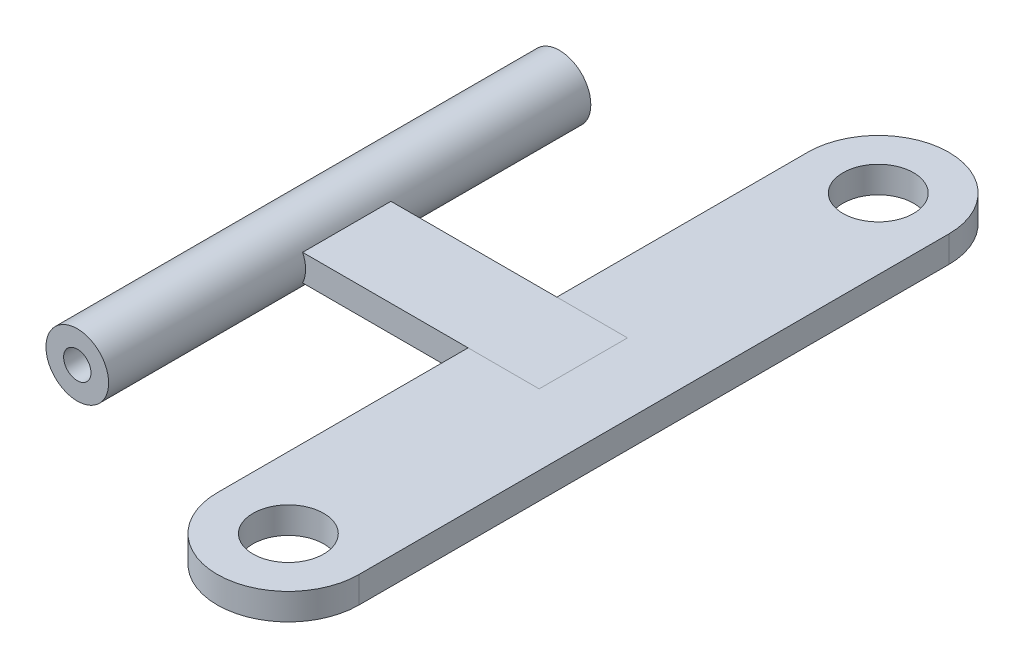
ISO-10303-21;
HEADER;
FILE_DESCRIPTION(('STEP AP214'),'2;1');
FILE_NAME('part.step','',(''),(''),'','','');
FILE_SCHEMA(('AUTOMOTIVE_DESIGN { 1 0 10303 214 1 1 1 1 }'));
ENDSEC;
DATA;
#1=APPLICATION_CONTEXT('core data for automotive mechanical design processes');
#2=APPLICATION_PROTOCOL_DEFINITION('international standard','automotive_design',2000,#1);
#3=PRODUCT_CONTEXT('',#1,'mechanical');
#4=PRODUCT('Part','Part','',(#3));
#5=PRODUCT_RELATED_PRODUCT_CATEGORY('part','',(#4));
#6=PRODUCT_DEFINITION_FORMATION('','',#4);
#7=PRODUCT_DEFINITION_CONTEXT('part definition',#1,'design');
#8=PRODUCT_DEFINITION('design','',#6,#7);
#9=PRODUCT_DEFINITION_SHAPE('','',#8);
#10=(LENGTH_UNIT() NAMED_UNIT(*) SI_UNIT(.MILLI.,.METRE.));
#11=(NAMED_UNIT(*) PLANE_ANGLE_UNIT() SI_UNIT($,.RADIAN.));
#12=(NAMED_UNIT(*) SI_UNIT($,.STERADIAN.) SOLID_ANGLE_UNIT());
#13=UNCERTAINTY_MEASURE_WITH_UNIT(LENGTH_MEASURE(1.E-05),#10,'distance_accuracy_value','');
#14=(GEOMETRIC_REPRESENTATION_CONTEXT(3) GLOBAL_UNCERTAINTY_ASSIGNED_CONTEXT((#13)) GLOBAL_UNIT_ASSIGNED_CONTEXT((#10,
#11,#12)) REPRESENTATION_CONTEXT('',''));
#15=CARTESIAN_POINT('',(0.,0.,0.));
#16=DIRECTION('',(0.,0.,1.));
#17=DIRECTION('',(1.,0.,0.));
#18=AXIS2_PLACEMENT_3D('',#15,#16,#17);
#19=CARTESIAN_POINT('',(38.0702596808361,-1.905,42.418));
#20=DIRECTION('',(0.,1.,0.));
#21=DIRECTION('',(-1.,0.,0.));
#22=AXIS2_PLACEMENT_3D('',#19,#20,#21);
#23=CYLINDRICAL_SURFACE('',#22,10.1897403191639);
#24=CARTESIAN_POINT('',(38.0702596808361,1.905,42.418));
#25=DIRECTION('',(0.,1.,0.));
#26=DIRECTION('',(-1.,0.,0.));
#27=AXIS2_PLACEMENT_3D('',#24,#25,#26);
#28=CIRCLE('',#27,10.1897403191639);
#29=CARTESIAN_POINT('',(27.8805193616721,1.905,42.418));
#30=VERTEX_POINT('',#29);
#31=CARTESIAN_POINT('',(48.26,1.90500000000001,42.418));
#32=VERTEX_POINT('',#31);
#33=EDGE_CURVE('E140',#30,#32,#28,.T.);
#34=ORIENTED_EDGE('',*,*,#33,.F.);
#35=DIRECTION('',(0.,1.,0.));
#36=VECTOR('',#35,1.);
#37=CARTESIAN_POINT('',(27.8805193616721,-1.905,42.418));
#38=LINE('',#37,#36);
#39=CARTESIAN_POINT('',(27.8805193616721,-1.905,42.418));
#40=VERTEX_POINT('',#39);
#41=EDGE_CURVE('E12',#40,#30,#38,.T.);
#42=ORIENTED_EDGE('',*,*,#41,.F.);
#43=CARTESIAN_POINT('',(38.0702596808361,-1.905,42.418));
#44=DIRECTION('',(0.,1.,0.));
#45=DIRECTION('',(-1.,0.,0.));
#46=AXIS2_PLACEMENT_3D('',#43,#44,#45);
#47=CIRCLE('',#46,10.1897403191639);
#48=CARTESIAN_POINT('',(48.26,-1.905,42.418));
#49=VERTEX_POINT('',#48);
#50=EDGE_CURVE('E161',#40,#49,#47,.T.);
#51=ORIENTED_EDGE('',*,*,#50,.T.);
#52=DIRECTION('',(0.,1.,0.));
#53=VECTOR('',#52,1.);
#54=CARTESIAN_POINT('',(48.26,-1.905,42.418));
#55=LINE('',#54,#53);
#56=EDGE_CURVE('E46',#49,#32,#55,.T.);
#57=ORIENTED_EDGE('',*,*,#56,.T.);
#58=EDGE_LOOP('',(#34,#42,#51,#57));
#59=FACE_BOUND('',#58,.T.);
#60=ADVANCED_FACE('F43',(#59),#23,.T.);
#61=CARTESIAN_POINT('',(27.8805193616721,-1.905,42.418));
#62=DIRECTION('',(-1.,0.,0.));
#63=DIRECTION('',(0.,-1.,0.));
#64=AXIS2_PLACEMENT_3D('',#61,#62,#63);
#65=PLANE('',#64);
#66=DIRECTION('',(0.,0.,1.));
#67=VECTOR('',#66,1.);
#68=CARTESIAN_POINT('',(27.8805193616721,1.905,42.418));
#69=LINE('',#68,#67);
#70=CARTESIAN_POINT('',(27.8805193616721,1.905,6.35));
#71=VERTEX_POINT('',#70);
#72=EDGE_CURVE('E159',#71,#30,#69,.T.);
#73=ORIENTED_EDGE('',*,*,#72,.F.);
#74=DIRECTION('',(0.,1.,0.));
#75=VECTOR('',#74,1.);
#76=CARTESIAN_POINT('',(27.8805193616721,-1.905,6.35));
#77=LINE('',#76,#75);
#78=CARTESIAN_POINT('',(27.8805193616721,-1.905,6.35));
#79=VERTEX_POINT('',#78);
#80=EDGE_CURVE('E52',#79,#71,#77,.T.);
#81=ORIENTED_EDGE('',*,*,#80,.F.);
#82=DIRECTION('',(0.,0.,1.));
#83=VECTOR('',#82,1.);
#84=CARTESIAN_POINT('',(27.8805193616721,-1.905,42.418));
#85=LINE('',#84,#83);
#86=EDGE_CURVE('E130',#79,#40,#85,.T.);
#87=ORIENTED_EDGE('',*,*,#86,.T.);
#88=ORIENTED_EDGE('',*,*,#41,.T.);
#89=EDGE_LOOP('',(#73,#81,#87,#88));
#90=FACE_BOUND('',#89,.T.);
#91=ADVANCED_FACE('F173',(#90),#65,.T.);
#92=CARTESIAN_POINT('',(38.1,-1.905,6.35));
#93=DIRECTION('',(0.,0.,-1.));
#94=DIRECTION('',(-1.,0.,0.));
#95=AXIS2_PLACEMENT_3D('',#92,#93,#94);
#96=PLANE('',#95);
#97=DIRECTION('',(-1.,0.,0.));
#98=VECTOR('',#97,1.);
#99=CARTESIAN_POINT('',(38.1,1.905,6.35));
#100=LINE('',#99,#98);
#101=CARTESIAN_POINT('',(38.1,1.905,6.35));
#102=VERTEX_POINT('',#101);
#103=EDGE_CURVE('E117',#102,#71,#100,.T.);
#104=ORIENTED_EDGE('',*,*,#103,.F.);
#105=DIRECTION('',(0.,1.,0.));
#106=VECTOR('',#105,1.);
#107=CARTESIAN_POINT('',(38.1,-1.905,6.35));
#108=LINE('',#107,#106);
#109=CARTESIAN_POINT('',(38.1,-1.905,6.35));
#110=VERTEX_POINT('',#109);
#111=EDGE_CURVE('E112',#110,#102,#108,.T.);
#112=ORIENTED_EDGE('',*,*,#111,.F.);
#113=DIRECTION('',(-1.,0.,0.));
#114=VECTOR('',#113,1.);
#115=CARTESIAN_POINT('',(38.1,-1.905,6.35));
#116=LINE('',#115,#114);
#117=EDGE_CURVE('E115',#110,#79,#116,.T.);
#118=ORIENTED_EDGE('',*,*,#117,.T.);
#119=ORIENTED_EDGE('',*,*,#80,.T.);
#120=EDGE_LOOP('',(#104,#112,#118,#119));
#121=FACE_BOUND('',#120,.T.);
#122=ADVANCED_FACE('F114',(#121),#96,.T.);
#123=CARTESIAN_POINT('',(38.1,-1.905,-6.35));
#124=DIRECTION('',(-1.,0.,0.));
#125=DIRECTION('',(0.,-1.,0.));
#126=AXIS2_PLACEMENT_3D('',#123,#124,#125);
#127=PLANE('',#126);
#128=DIRECTION('',(0.,0.,1.));
#129=VECTOR('',#128,1.);
#130=CARTESIAN_POINT('',(38.1,1.905,-6.35));
#131=LINE('',#130,#129);
#132=CARTESIAN_POINT('',(38.1,1.905,-6.35));
#133=VERTEX_POINT('',#132);
#134=EDGE_CURVE('E156',#133,#102,#131,.T.);
#135=ORIENTED_EDGE('',*,*,#134,.F.);
#136=DIRECTION('',(0.,1.,0.));
#137=VECTOR('',#136,1.);
#138=CARTESIAN_POINT('',(38.1,-1.905,-6.35));
#139=LINE('',#138,#137);
#140=CARTESIAN_POINT('',(38.1,-1.905,-6.35));
#141=VERTEX_POINT('',#140);
#142=EDGE_CURVE('E122',#141,#133,#139,.T.);
#143=ORIENTED_EDGE('',*,*,#142,.F.);
#144=DIRECTION('',(0.,0.,1.));
#145=VECTOR('',#144,1.);
#146=CARTESIAN_POINT('',(38.1,-1.905,-6.35));
#147=LINE('',#146,#145);
#148=EDGE_CURVE('E128',#141,#110,#147,.T.);
#149=ORIENTED_EDGE('',*,*,#148,.T.);
#150=ORIENTED_EDGE('',*,*,#111,.T.);
#151=EDGE_LOOP('',(#135,#143,#149,#150));
#152=FACE_BOUND('',#151,.T.);
#153=ADVANCED_FACE('F132',(#152),#127,.T.);
#154=CARTESIAN_POINT('',(27.94,-1.905,-6.35));
#155=DIRECTION('',(0.,0.,1.));
#156=DIRECTION('',(1.,0.,0.));
#157=AXIS2_PLACEMENT_3D('',#154,#155,#156);
#158=PLANE('',#157);
#159=DIRECTION('',(1.,0.,0.));
#160=VECTOR('',#159,1.);
#161=CARTESIAN_POINT('',(27.94,1.905,-6.35));
#162=LINE('',#161,#160);
#163=CARTESIAN_POINT('',(27.94,1.905,-6.35));
#164=VERTEX_POINT('',#163);
#165=EDGE_CURVE('E153',#164,#133,#162,.T.);
#166=ORIENTED_EDGE('',*,*,#165,.F.);
#167=DIRECTION('',(0.,1.,0.));
#168=VECTOR('',#167,1.);
#169=CARTESIAN_POINT('',(27.94,-1.905,-6.35));
#170=LINE('',#169,#168);
#171=CARTESIAN_POINT('',(27.94,-1.905,-6.35));
#172=VERTEX_POINT('',#171);
#173=EDGE_CURVE('E165',#172,#164,#170,.T.);
#174=ORIENTED_EDGE('',*,*,#173,.F.);
#175=DIRECTION('',(1.,0.,0.));
#176=VECTOR('',#175,1.);
#177=CARTESIAN_POINT('',(27.94,-1.905,-6.35));
#178=LINE('',#177,#176);
#179=EDGE_CURVE('E133',#172,#141,#178,.T.);
#180=ORIENTED_EDGE('',*,*,#179,.T.);
#181=ORIENTED_EDGE('',*,*,#142,.T.);
#182=EDGE_LOOP('',(#166,#174,#180,#181));
#183=FACE_BOUND('',#182,.T.);
#184=ADVANCED_FACE('F186',(#183),#158,.T.);
#185=CARTESIAN_POINT('',(27.94,-1.905,-6.35));
#186=DIRECTION('',(-1.,0.,0.));
#187=DIRECTION('',(0.,-1.,0.));
#188=AXIS2_PLACEMENT_3D('',#185,#186,#187);
#189=PLANE('',#188);
#190=DIRECTION('',(0.,0.,1.));
#191=VECTOR('',#190,1.);
#192=CARTESIAN_POINT('',(27.94,1.905,-6.35));
#193=LINE('',#192,#191);
#194=CARTESIAN_POINT('',(27.94,1.905,-42.418));
#195=VERTEX_POINT('',#194);
#196=EDGE_CURVE('E150',#195,#164,#193,.T.);
#197=ORIENTED_EDGE('',*,*,#196,.F.);
#198=DIRECTION('',(0.,1.,0.));
#199=VECTOR('',#198,1.);
#200=CARTESIAN_POINT('',(27.94,-1.905,-42.418));
#201=LINE('',#200,#199);
#202=CARTESIAN_POINT('',(27.94,-1.905,-42.418));
#203=VERTEX_POINT('',#202);
#204=EDGE_CURVE('E167',#203,#195,#201,.T.);
#205=ORIENTED_EDGE('',*,*,#204,.F.);
#206=DIRECTION('',(0.,0.,1.));
#207=VECTOR('',#206,1.);
#208=CARTESIAN_POINT('',(27.94,-1.905,-6.35));
#209=LINE('',#208,#207);
#210=EDGE_CURVE('E135',#203,#172,#209,.T.);
#211=ORIENTED_EDGE('',*,*,#210,.T.);
#212=ORIENTED_EDGE('',*,*,#173,.T.);
#213=EDGE_LOOP('',(#197,#205,#211,#212));
#214=FACE_BOUND('',#213,.T.);
#215=ADVANCED_FACE('F189',(#214),#189,.T.);
#216=CARTESIAN_POINT('',(38.1,-1.905,-42.418));
#217=DIRECTION('',(0.,1.,0.));
#218=DIRECTION('',(-1.,0.,0.));
#219=AXIS2_PLACEMENT_3D('',#216,#217,#218);
#220=CYLINDRICAL_SURFACE('',#219,10.16);
#221=CARTESIAN_POINT('',(38.1,1.905,-42.418));
#222=DIRECTION('',(0.,1.,0.));
#223=DIRECTION('',(1.,0.,0.));
#224=AXIS2_PLACEMENT_3D('',#221,#222,#223);
#225=CIRCLE('',#224,10.16);
#226=CARTESIAN_POINT('',(48.26,1.90500000000001,-42.418));
#227=VERTEX_POINT('',#226);
#228=EDGE_CURVE('E147',#227,#195,#225,.T.);
#229=ORIENTED_EDGE('',*,*,#228,.F.);
#230=DIRECTION('',(0.,1.,0.));
#231=VECTOR('',#230,1.);
#232=CARTESIAN_POINT('',(48.26,-1.905,-42.418));
#233=LINE('',#232,#231);
#234=CARTESIAN_POINT('',(48.26,-1.905,-42.418));
#235=VERTEX_POINT('',#234);
#236=EDGE_CURVE('E168',#235,#227,#233,.T.);
#237=ORIENTED_EDGE('',*,*,#236,.F.);
#238=CARTESIAN_POINT('',(38.1,-1.905,-42.418));
#239=DIRECTION('',(0.,1.,0.));
#240=DIRECTION('',(1.,0.,0.));
#241=AXIS2_PLACEMENT_3D('',#238,#239,#240);
#242=CIRCLE('',#241,10.16);
#243=EDGE_CURVE('E235',#235,#203,#242,.T.);
#244=ORIENTED_EDGE('',*,*,#243,.T.);
#245=ORIENTED_EDGE('',*,*,#204,.T.);
#246=EDGE_LOOP('',(#229,#237,#244,#245));
#247=FACE_BOUND('',#246,.T.);
#248=ADVANCED_FACE('F193',(#247),#220,.T.);
#249=CARTESIAN_POINT('',(48.26,-1.905,-42.418));
#250=DIRECTION('',(1.,0.,0.));
#251=DIRECTION('',(0.,1.,0.));
#252=AXIS2_PLACEMENT_3D('',#249,#250,#251);
#253=PLANE('',#252);
#254=DIRECTION('',(0.,0.,-1.));
#255=VECTOR('',#254,1.);
#256=CARTESIAN_POINT('',(48.26,1.90500000000001,-42.418));
#257=LINE('',#256,#255);
#258=EDGE_CURVE('E143',#32,#227,#257,.T.);
#259=ORIENTED_EDGE('',*,*,#258,.F.);
#260=ORIENTED_EDGE('',*,*,#56,.F.);
#261=DIRECTION('',(0.,0.,-1.));
#262=VECTOR('',#261,1.);
#263=CARTESIAN_POINT('',(48.26,-1.905,-42.418));
#264=LINE('',#263,#262);
#265=EDGE_CURVE('E233',#49,#235,#264,.T.);
#266=ORIENTED_EDGE('',*,*,#265,.T.);
#267=ORIENTED_EDGE('',*,*,#236,.T.);
#268=EDGE_LOOP('',(#259,#260,#266,#267));
#269=FACE_BOUND('',#268,.T.);
#270=ADVANCED_FACE('F170',(#269),#253,.T.);
#271=CARTESIAN_POINT('',(38.0702596808361,-1.905,42.418));
#272=DIRECTION('',(0.,1.,0.));
#273=DIRECTION('',(-1.,0.,0.));
#274=AXIS2_PLACEMENT_3D('',#271,#272,#273);
#275=PLANE('',#274);
#276=CARTESIAN_POINT('',(38.1,-1.905,-42.418));
#277=DIRECTION('',(0.,1.,0.));
#278=DIRECTION('',(-1.,0.,0.));
#279=AXIS2_PLACEMENT_3D('',#276,#277,#278);
#280=CIRCLE('',#279,5.08000000000001);
#281=CARTESIAN_POINT('',(33.02,-1.905,-42.418));
#282=VERTEX_POINT('',#281);
#283=EDGE_CURVE('E220',#282,#282,#280,.T.);
#284=ORIENTED_EDGE('',*,*,#283,.T.);
#285=EDGE_LOOP('',(#284));
#286=FACE_BOUND('',#285,.T.);
#287=CARTESIAN_POINT('',(38.1,-1.905,42.418));
#288=DIRECTION('',(0.,1.,0.));
#289=DIRECTION('',(-1.,0.,0.));
#290=AXIS2_PLACEMENT_3D('',#287,#288,#289);
#291=CIRCLE('',#290,5.08000000000001);
#292=CARTESIAN_POINT('',(33.02,-1.905,42.418));
#293=VERTEX_POINT('',#292);
#294=EDGE_CURVE('E144',#293,#293,#291,.T.);
#295=ORIENTED_EDGE('',*,*,#294,.T.);
#296=EDGE_LOOP('',(#295));
#297=FACE_BOUND('',#296,.T.);
#298=ORIENTED_EDGE('',*,*,#50,.F.);
#299=ORIENTED_EDGE('',*,*,#86,.F.);
#300=ORIENTED_EDGE('',*,*,#117,.F.);
#301=ORIENTED_EDGE('',*,*,#148,.F.);
#302=ORIENTED_EDGE('',*,*,#179,.F.);
#303=ORIENTED_EDGE('',*,*,#210,.F.);
#304=ORIENTED_EDGE('',*,*,#243,.F.);
#305=ORIENTED_EDGE('',*,*,#265,.F.);
#306=EDGE_LOOP('',(#298,#299,#300,#301,#302,#303,#304,#305));
#307=FACE_BOUND('',#306,.T.);
#308=ADVANCED_FACE('F126',(#286,#297,#307),#275,.F.);
#309=CARTESIAN_POINT('',(38.0702596808361,1.905,42.418));
#310=DIRECTION('',(0.,1.,0.));
#311=DIRECTION('',(-1.,0.,0.));
#312=AXIS2_PLACEMENT_3D('',#309,#310,#311);
#313=PLANE('',#312);
#314=CARTESIAN_POINT('',(38.1,1.905,-42.418));
#315=DIRECTION('',(0.,1.,0.));
#316=DIRECTION('',(-1.,0.,0.));
#317=AXIS2_PLACEMENT_3D('',#314,#315,#316);
#318=CIRCLE('',#317,5.08000000000001);
#319=CARTESIAN_POINT('',(33.02,1.905,-42.418));
#320=VERTEX_POINT('',#319);
#321=EDGE_CURVE('E223',#320,#320,#318,.T.);
#322=ORIENTED_EDGE('',*,*,#321,.F.);
#323=EDGE_LOOP('',(#322));
#324=FACE_BOUND('',#323,.T.);
#325=CARTESIAN_POINT('',(38.1,1.905,42.418));
#326=DIRECTION('',(0.,1.,0.));
#327=DIRECTION('',(-1.,0.,0.));
#328=AXIS2_PLACEMENT_3D('',#325,#326,#327);
#329=CIRCLE('',#328,5.08000000000001);
#330=CARTESIAN_POINT('',(33.02,1.905,42.418));
#331=VERTEX_POINT('',#330);
#332=EDGE_CURVE('E225',#331,#331,#329,.T.);
#333=ORIENTED_EDGE('',*,*,#332,.F.);
#334=EDGE_LOOP('',(#333));
#335=FACE_BOUND('',#334,.T.);
#336=ORIENTED_EDGE('',*,*,#33,.T.);
#337=ORIENTED_EDGE('',*,*,#258,.T.);
#338=ORIENTED_EDGE('',*,*,#228,.T.);
#339=ORIENTED_EDGE('',*,*,#196,.T.);
#340=ORIENTED_EDGE('',*,*,#165,.T.);
#341=ORIENTED_EDGE('',*,*,#134,.T.);
#342=ORIENTED_EDGE('',*,*,#103,.T.);
#343=ORIENTED_EDGE('',*,*,#72,.T.);
#344=EDGE_LOOP('',(#336,#337,#338,#339,#340,#341,#342,#343));
#345=FACE_BOUND('',#344,.T.);
#346=ADVANCED_FACE('F172',(#324,#335,#345),#313,.T.);
#347=CARTESIAN_POINT('',(38.1,-1.905,42.418));
#348=DIRECTION('',(0.,1.,0.));
#349=DIRECTION('',(-1.,0.,0.));
#350=AXIS2_PLACEMENT_3D('',#347,#348,#349);
#351=CYLINDRICAL_SURFACE('',#350,5.08000000000001);
#352=ORIENTED_EDGE('',*,*,#294,.F.);
#353=EDGE_LOOP('',(#352));
#354=FACE_BOUND('',#353,.T.);
#355=ORIENTED_EDGE('',*,*,#332,.T.);
#356=EDGE_LOOP('',(#355));
#357=FACE_BOUND('',#356,.T.);
#358=ADVANCED_FACE('F205',(#354,#357),#351,.F.);
#359=CARTESIAN_POINT('',(38.1,-1.905,-42.418));
#360=DIRECTION('',(0.,1.,0.));
#361=DIRECTION('',(-1.,0.,0.));
#362=AXIS2_PLACEMENT_3D('',#359,#360,#361);
#363=CYLINDRICAL_SURFACE('',#362,5.08000000000001);
#364=ORIENTED_EDGE('',*,*,#283,.F.);
#365=EDGE_LOOP('',(#364));
#366=FACE_BOUND('',#365,.T.);
#367=ORIENTED_EDGE('',*,*,#321,.T.);
#368=EDGE_LOOP('',(#367));
#369=FACE_BOUND('',#368,.T.);
#370=ADVANCED_FACE('F212',(#366,#369),#363,.F.);
#371=CLOSED_SHELL('',(#60,#91,#122,#153,#184,#215,#248,#270,#308,#346,#358,#370));
#372=MANIFOLD_SOLID_BREP('B2',#371);
#373=CARTESIAN_POINT('',(0.,0.,-34.671));
#374=DIRECTION('',(0.,0.,1.));
#375=DIRECTION('',(1.,0.,0.));
#376=AXIS2_PLACEMENT_3D('',#373,#374,#375);
#377=CYLINDRICAL_SURFACE('',#376,4.5085);
#378=CARTESIAN_POINT('',(0.,0.,-34.671));
#379=DIRECTION('',(0.,0.,1.));
#380=DIRECTION('',(1.,0.,0.));
#381=AXIS2_PLACEMENT_3D('',#378,#379,#380);
#382=CIRCLE('',#381,4.5085);
#383=CARTESIAN_POINT('',(4.5085,0.,-34.671));
#384=VERTEX_POINT('',#383);
#385=EDGE_CURVE('E393',#384,#384,#382,.T.);
#386=ORIENTED_EDGE('',*,*,#385,.T.);
#387=EDGE_LOOP('',(#386));
#388=FACE_BOUND('',#387,.T.);
#389=CARTESIAN_POINT('',(0.,0.,34.671));
#390=DIRECTION('',(0.,0.,1.));
#391=DIRECTION('',(1.,0.,0.));
#392=AXIS2_PLACEMENT_3D('',#389,#390,#391);
#393=CIRCLE('',#392,4.5085);
#394=CARTESIAN_POINT('',(4.5085,0.,34.671));
#395=VERTEX_POINT('',#394);
#396=EDGE_CURVE('E387',#395,#395,#393,.T.);
#397=ORIENTED_EDGE('',*,*,#396,.F.);
#398=EDGE_LOOP('',(#397));
#399=FACE_BOUND('',#398,.T.);
#400=DIRECTION('',(0.,0.,1.));
#401=VECTOR('',#400,1.);
#402=CARTESIAN_POINT('',(4.08626323797183,1.905,-34.671));
#403=LINE('',#402,#401);
#404=CARTESIAN_POINT('',(4.08626323797183,1.905,6.35));
#405=VERTEX_POINT('',#404);
#406=CARTESIAN_POINT('',(4.08626323797183,1.905,-6.35));
#407=VERTEX_POINT('',#406);
#408=EDGE_CURVE('E320',#405,#407,#403,.F.);
#409=ORIENTED_EDGE('',*,*,#408,.T.);
#410=CARTESIAN_POINT('',(0.,0.,-6.35));
#411=DIRECTION('',(0.,0.,1.));
#412=DIRECTION('',(1.,0.,0.));
#413=AXIS2_PLACEMENT_3D('',#410,#411,#412);
#414=CIRCLE('',#413,4.5085);
#415=CARTESIAN_POINT('',(4.08626323797183,-1.905,-6.35));
#416=VERTEX_POINT('',#415);
#417=EDGE_CURVE('E327',#407,#416,#414,.F.);
#418=ORIENTED_EDGE('',*,*,#417,.T.);
#419=DIRECTION('',(0.,0.,1.));
#420=VECTOR('',#419,1.);
#421=CARTESIAN_POINT('',(4.08626323797183,-1.905,-34.671));
#422=LINE('',#421,#420);
#423=CARTESIAN_POINT('',(4.08626323797183,-1.905,6.35));
#424=VERTEX_POINT('',#423);
#425=EDGE_CURVE('E41',#424,#416,#422,.F.);
#426=ORIENTED_EDGE('',*,*,#425,.F.);
#427=CARTESIAN_POINT('',(0.,0.,6.35));
#428=DIRECTION('',(0.,0.,1.));
#429=DIRECTION('',(1.,0.,0.));
#430=AXIS2_PLACEMENT_3D('',#427,#428,#429);
#431=CIRCLE('',#430,4.5085);
#432=EDGE_CURVE('E356',#405,#424,#431,.F.);
#433=ORIENTED_EDGE('',*,*,#432,.F.);
#434=EDGE_LOOP('',(#409,#418,#426,#433));
#435=FACE_BOUND('',#434,.T.);
#436=ADVANCED_FACE('F313',(#388,#399,#435),#377,.T.);
#437=CARTESIAN_POINT('',(0.,0.,-34.671));
#438=DIRECTION('',(0.,0.,1.));
#439=DIRECTION('',(1.,0.,0.));
#440=AXIS2_PLACEMENT_3D('',#437,#438,#439);
#441=PLANE('',#440);
#442=CARTESIAN_POINT('',(0.,0.,-34.671));
#443=DIRECTION('',(0.,0.,1.));
#444=DIRECTION('',(1.,0.,0.));
#445=AXIS2_PLACEMENT_3D('',#442,#443,#444);
#446=CIRCLE('',#445,1.9685);
#447=CARTESIAN_POINT('',(1.9685,0.,-34.671));
#448=VERTEX_POINT('',#447);
#449=EDGE_CURVE('E390',#448,#448,#446,.T.);
#450=ORIENTED_EDGE('',*,*,#449,.T.);
#451=EDGE_LOOP('',(#450));
#452=FACE_BOUND('',#451,.T.);
#453=ORIENTED_EDGE('',*,*,#385,.F.);
#454=EDGE_LOOP('',(#453));
#455=FACE_BOUND('',#454,.T.);
#456=ADVANCED_FACE('F399',(#452,#455),#441,.F.);
#457=CARTESIAN_POINT('',(0.,0.,-34.671));
#458=DIRECTION('',(0.,0.,1.));
#459=DIRECTION('',(1.,0.,0.));
#460=AXIS2_PLACEMENT_3D('',#457,#458,#459);
#461=CYLINDRICAL_SURFACE('',#460,1.9685);
#462=ORIENTED_EDGE('',*,*,#449,.F.);
#463=EDGE_LOOP('',(#462));
#464=FACE_BOUND('',#463,.T.);
#465=CARTESIAN_POINT('',(0.,0.,34.671));
#466=DIRECTION('',(0.,0.,1.));
#467=DIRECTION('',(1.,0.,0.));
#468=AXIS2_PLACEMENT_3D('',#465,#466,#467);
#469=CIRCLE('',#468,1.9685);
#470=CARTESIAN_POINT('',(1.9685,0.,34.671));
#471=VERTEX_POINT('',#470);
#472=EDGE_CURVE('E384',#471,#471,#469,.T.);
#473=ORIENTED_EDGE('',*,*,#472,.T.);
#474=EDGE_LOOP('',(#473));
#475=FACE_BOUND('',#474,.T.);
#476=ADVANCED_FACE('F401',(#464,#475),#461,.F.);
#477=CARTESIAN_POINT('',(0.,0.,34.671));
#478=DIRECTION('',(0.,0.,1.));
#479=DIRECTION('',(1.,0.,0.));
#480=AXIS2_PLACEMENT_3D('',#477,#478,#479);
#481=PLANE('',#480);
#482=ORIENTED_EDGE('',*,*,#396,.T.);
#483=EDGE_LOOP('',(#482));
#484=FACE_BOUND('',#483,.T.);
#485=ORIENTED_EDGE('',*,*,#472,.F.);
#486=EDGE_LOOP('',(#485));
#487=FACE_BOUND('',#486,.T.);
#488=ADVANCED_FACE('F407',(#484,#487),#481,.T.);
#489=CARTESIAN_POINT('',(0.,-1.905,-6.35));
#490=DIRECTION('',(0.,-1.,0.));
#491=DIRECTION('',(0.,0.,-1.));
#492=AXIS2_PLACEMENT_3D('',#489,#490,#491);
#493=PLANE('',#492);
#494=DIRECTION('',(1.,0.,0.));
#495=VECTOR('',#494,1.);
#496=CARTESIAN_POINT('',(0.,-1.905,6.35));
#497=LINE('',#496,#495);
#498=CARTESIAN_POINT('',(38.1,-1.905,6.35));
#499=VERTEX_POINT('',#498);
#500=EDGE_CURVE('E350',#424,#499,#497,.T.);
#501=ORIENTED_EDGE('',*,*,#500,.F.);
#502=ORIENTED_EDGE('',*,*,#425,.T.);
#503=DIRECTION('',(1.,0.,0.));
#504=VECTOR('',#503,1.);
#505=CARTESIAN_POINT('',(0.,-1.905,-6.35));
#506=LINE('',#505,#504);
#507=CARTESIAN_POINT('',(38.1,-1.905,-6.35));
#508=VERTEX_POINT('',#507);
#509=EDGE_CURVE('E363',#416,#508,#506,.T.);
#510=ORIENTED_EDGE('',*,*,#509,.T.);
#511=DIRECTION('',(0.,0.,1.));
#512=VECTOR('',#511,1.);
#513=CARTESIAN_POINT('',(38.1,-1.905,-6.35));
#514=LINE('',#513,#512);
#515=EDGE_CURVE('E360',#508,#499,#514,.T.);
#516=ORIENTED_EDGE('',*,*,#515,.T.);
#517=EDGE_LOOP('',(#501,#502,#510,#516));
#518=FACE_BOUND('',#517,.T.);
#519=ADVANCED_FACE('F361',(#518),#493,.T.);
#520=CARTESIAN_POINT('',(0.,1.905,-6.35));
#521=DIRECTION('',(0.,-1.,0.));
#522=DIRECTION('',(1.,0.,0.));
#523=AXIS2_PLACEMENT_3D('',#520,#521,#522);
#524=PLANE('',#523);
#525=ORIENTED_EDGE('',*,*,#408,.F.);
#526=DIRECTION('',(1.,0.,0.));
#527=VECTOR('',#526,1.);
#528=CARTESIAN_POINT('',(0.,1.905,6.35));
#529=LINE('',#528,#527);
#530=CARTESIAN_POINT('',(38.1,1.905,6.35));
#531=VERTEX_POINT('',#530);
#532=EDGE_CURVE('E373',#405,#531,#529,.T.);
#533=ORIENTED_EDGE('',*,*,#532,.T.);
#534=DIRECTION('',(0.,0.,1.));
#535=VECTOR('',#534,1.);
#536=CARTESIAN_POINT('',(38.1,1.905,-6.35));
#537=LINE('',#536,#535);
#538=CARTESIAN_POINT('',(38.1,1.905,-6.35));
#539=VERTEX_POINT('',#538);
#540=EDGE_CURVE('E367',#539,#531,#537,.T.);
#541=ORIENTED_EDGE('',*,*,#540,.F.);
#542=DIRECTION('',(1.,0.,0.));
#543=VECTOR('',#542,1.);
#544=CARTESIAN_POINT('',(0.,1.905,-6.35));
#545=LINE('',#544,#543);
#546=EDGE_CURVE('E368',#407,#539,#545,.T.);
#547=ORIENTED_EDGE('',*,*,#546,.F.);
#548=EDGE_LOOP('',(#525,#533,#541,#547));
#549=FACE_BOUND('',#548,.T.);
#550=ADVANCED_FACE('F416',(#549),#524,.F.);
#551=CARTESIAN_POINT('',(38.1,0.,-6.35));
#552=DIRECTION('',(1.,0.,0.));
#553=DIRECTION('',(0.,0.,-1.));
#554=AXIS2_PLACEMENT_3D('',#551,#552,#553);
#555=PLANE('',#554);
#556=ORIENTED_EDGE('',*,*,#540,.T.);
#557=DIRECTION('',(0.,1.,0.));
#558=VECTOR('',#557,1.);
#559=CARTESIAN_POINT('',(38.1,0.,6.35));
#560=LINE('',#559,#558);
#561=EDGE_CURVE('E355',#499,#531,#560,.T.);
#562=ORIENTED_EDGE('',*,*,#561,.F.);
#563=ORIENTED_EDGE('',*,*,#515,.F.);
#564=DIRECTION('',(0.,1.,0.));
#565=VECTOR('',#564,1.);
#566=CARTESIAN_POINT('',(38.1,0.,-6.35));
#567=LINE('',#566,#565);
#568=EDGE_CURVE('E378',#508,#539,#567,.T.);
#569=ORIENTED_EDGE('',*,*,#568,.T.);
#570=EDGE_LOOP('',(#556,#562,#563,#569));
#571=FACE_BOUND('',#570,.T.);
#572=ADVANCED_FACE('F371',(#571),#555,.T.);
#573=CARTESIAN_POINT('',(0.,0.,-6.35));
#574=DIRECTION('',(0.,0.,1.));
#575=DIRECTION('',(1.,0.,0.));
#576=AXIS2_PLACEMENT_3D('',#573,#574,#575);
#577=PLANE('',#576);
#578=ORIENTED_EDGE('',*,*,#417,.F.);
#579=ORIENTED_EDGE('',*,*,#546,.T.);
#580=ORIENTED_EDGE('',*,*,#568,.F.);
#581=ORIENTED_EDGE('',*,*,#509,.F.);
#582=EDGE_LOOP('',(#578,#579,#580,#581));
#583=FACE_BOUND('',#582,.T.);
#584=ADVANCED_FACE('F419',(#583),#577,.F.);
#585=CARTESIAN_POINT('',(0.,0.,6.35));
#586=DIRECTION('',(0.,0.,1.));
#587=DIRECTION('',(1.,0.,0.));
#588=AXIS2_PLACEMENT_3D('',#585,#586,#587);
#589=PLANE('',#588);
#590=ORIENTED_EDGE('',*,*,#532,.F.);
#591=ORIENTED_EDGE('',*,*,#432,.T.);
#592=ORIENTED_EDGE('',*,*,#500,.T.);
#593=ORIENTED_EDGE('',*,*,#561,.T.);
#594=EDGE_LOOP('',(#590,#591,#592,#593));
#595=FACE_BOUND('',#594,.T.);
#596=ADVANCED_FACE('F353',(#595),#589,.T.);
#597=CLOSED_SHELL('',(#436,#456,#476,#488,#519,#550,#572,#584,#596));
#598=MANIFOLD_SOLID_BREP('B6',#597);
#599=ADVANCED_BREP_SHAPE_REPRESENTATION('',(#18,#372,#598),#14);
#600=SHAPE_DEFINITION_REPRESENTATION(#9,#599);
ENDSEC;
END-ISO-10303-21;
